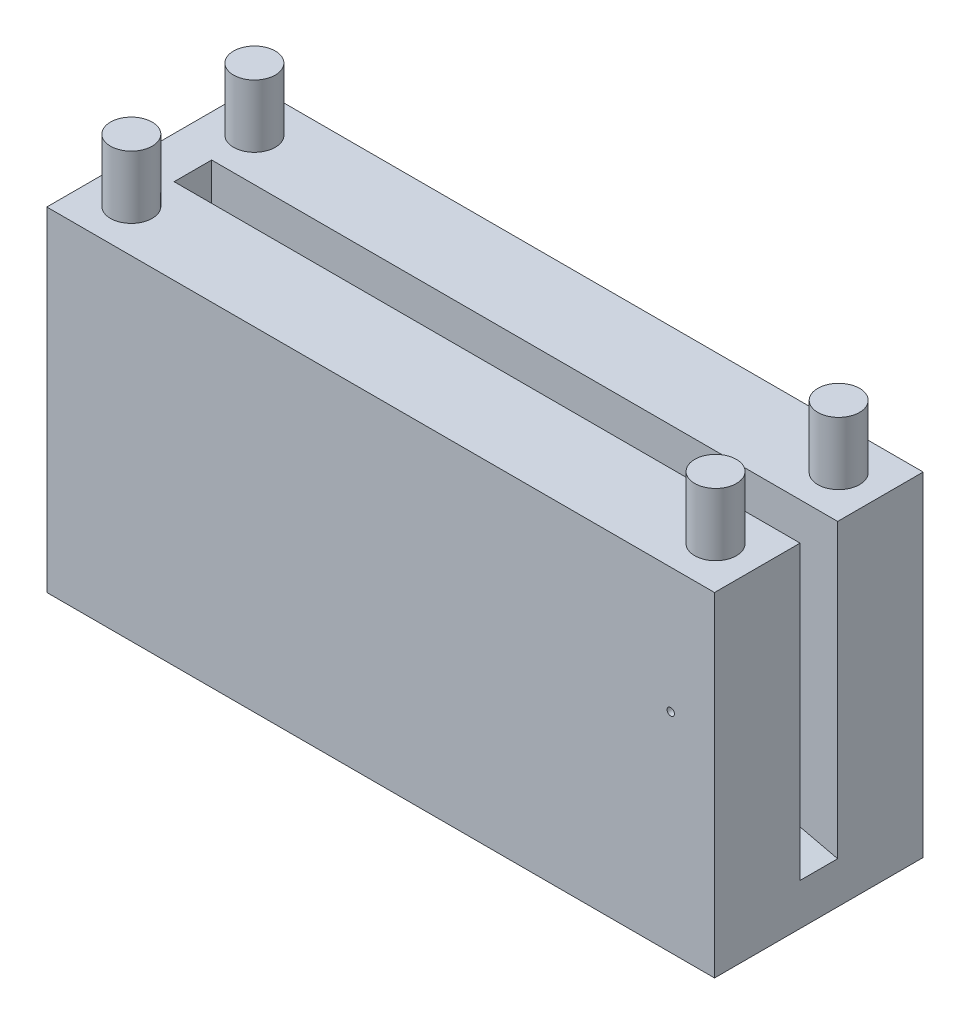
ISO-10303-21;
HEADER;
FILE_DESCRIPTION(('STEP AP214'),'2;1');
FILE_NAME('part.step','',(''),(''),'','','');
FILE_SCHEMA(('AUTOMOTIVE_DESIGN { 1 0 10303 214 1 1 1 1 }'));
ENDSEC;
DATA;
#1=APPLICATION_CONTEXT('core data for automotive mechanical design processes');
#2=APPLICATION_PROTOCOL_DEFINITION('international standard','automotive_design',2000,#1);
#3=PRODUCT_CONTEXT('',#1,'mechanical');
#4=PRODUCT('Part','Part','',(#3));
#5=PRODUCT_RELATED_PRODUCT_CATEGORY('part','',(#4));
#6=PRODUCT_DEFINITION_FORMATION('','',#4);
#7=PRODUCT_DEFINITION_CONTEXT('part definition',#1,'design');
#8=PRODUCT_DEFINITION('design','',#6,#7);
#9=PRODUCT_DEFINITION_SHAPE('','',#8);
#10=(LENGTH_UNIT() NAMED_UNIT(*) SI_UNIT(.MILLI.,.METRE.));
#11=(NAMED_UNIT(*) PLANE_ANGLE_UNIT() SI_UNIT($,.RADIAN.));
#12=(NAMED_UNIT(*) SI_UNIT($,.STERADIAN.) SOLID_ANGLE_UNIT());
#13=UNCERTAINTY_MEASURE_WITH_UNIT(LENGTH_MEASURE(1.E-05),#10,'distance_accuracy_value','');
#14=(GEOMETRIC_REPRESENTATION_CONTEXT(3) GLOBAL_UNCERTAINTY_ASSIGNED_CONTEXT((#13)) GLOBAL_UNIT_ASSIGNED_CONTEXT((#10,
#11,#12)) REPRESENTATION_CONTEXT('',''));
#15=CARTESIAN_POINT('',(0.,0.,0.));
#16=DIRECTION('',(0.,0.,1.));
#17=DIRECTION('',(1.,0.,0.));
#18=AXIS2_PLACEMENT_3D('',#15,#16,#17);
#19=CARTESIAN_POINT('',(101.6,101.6,-31.75));
#20=DIRECTION('',(-1.,0.,0.));
#21=DIRECTION('',(0.,0.,1.));
#22=AXIS2_PLACEMENT_3D('',#19,#20,#21);
#23=PLANE('',#22);
#24=DIRECTION('',(0.,1.,0.));
#25=VECTOR('',#24,1.);
#26=CARTESIAN_POINT('',(101.6,95.25,-5.71500000000001));
#27=LINE('',#26,#25);
#28=CARTESIAN_POINT('',(101.6,12.7,-5.71500000000001));
#29=VERTEX_POINT('',#28);
#30=CARTESIAN_POINT('',(101.6,101.6,-5.71500000000001));
#31=VERTEX_POINT('',#30);
#32=EDGE_CURVE('E117',#29,#31,#27,.T.);
#33=ORIENTED_EDGE('',*,*,#32,.F.);
#34=DIRECTION('',(0.,0.,-1.));
#35=VECTOR('',#34,1.);
#36=CARTESIAN_POINT('',(101.6,12.7,215.937406037035));
#37=LINE('',#36,#35);
#38=CARTESIAN_POINT('',(101.6,12.7,5.715));
#39=VERTEX_POINT('',#38);
#40=EDGE_CURVE('E124',#39,#29,#37,.T.);
#41=ORIENTED_EDGE('',*,*,#40,.F.);
#42=DIRECTION('',(0.,1.,0.));
#43=VECTOR('',#42,1.);
#44=CARTESIAN_POINT('',(101.6,95.25,5.71499999999999));
#45=LINE('',#44,#43);
#46=CARTESIAN_POINT('',(101.6,101.6,5.71499999999999));
#47=VERTEX_POINT('',#46);
#48=EDGE_CURVE('E107',#39,#47,#45,.T.);
#49=ORIENTED_EDGE('',*,*,#48,.T.);
#50=DIRECTION('',(0.,0.,-1.));
#51=VECTOR('',#50,1.);
#52=CARTESIAN_POINT('',(101.6,101.6,-31.75));
#53=LINE('',#52,#51);
#54=CARTESIAN_POINT('',(101.6,101.6,31.75));
#55=VERTEX_POINT('',#54);
#56=EDGE_CURVE('E144',#55,#47,#53,.T.);
#57=ORIENTED_EDGE('',*,*,#56,.F.);
#58=DIRECTION('',(0.,-1.,0.));
#59=VECTOR('',#58,1.);
#60=CARTESIAN_POINT('',(101.6,101.6,31.75));
#61=LINE('',#60,#59);
#62=CARTESIAN_POINT('',(101.6,0.,31.75));
#63=VERTEX_POINT('',#62);
#64=EDGE_CURVE('E151',#55,#63,#61,.T.);
#65=ORIENTED_EDGE('',*,*,#64,.T.);
#66=DIRECTION('',(0.,0.,-1.));
#67=VECTOR('',#66,1.);
#68=CARTESIAN_POINT('',(101.6,0.,-31.75));
#69=LINE('',#68,#67);
#70=CARTESIAN_POINT('',(101.6,0.,-31.75));
#71=VERTEX_POINT('',#70);
#72=EDGE_CURVE('E140',#63,#71,#69,.T.);
#73=ORIENTED_EDGE('',*,*,#72,.T.);
#74=DIRECTION('',(0.,-1.,0.));
#75=VECTOR('',#74,1.);
#76=CARTESIAN_POINT('',(101.6,101.6,-31.75));
#77=LINE('',#76,#75);
#78=CARTESIAN_POINT('',(101.6,101.6,-31.75));
#79=VERTEX_POINT('',#78);
#80=EDGE_CURVE('E11',#79,#71,#77,.T.);
#81=ORIENTED_EDGE('',*,*,#80,.F.);
#82=EDGE_CURVE('E84',#31,#79,#53,.T.);
#83=ORIENTED_EDGE('',*,*,#82,.F.);
#84=EDGE_LOOP('',(#33,#41,#49,#57,#65,#73,#81,#83));
#85=FACE_BOUND('',#84,.T.);
#86=ADVANCED_FACE('F33',(#85),#23,.F.);
#87=CARTESIAN_POINT('',(-101.6,101.6,-31.75));
#88=DIRECTION('',(0.,0.,1.));
#89=DIRECTION('',(1.,0.,0.));
#90=AXIS2_PLACEMENT_3D('',#87,#88,#89);
#91=PLANE('',#90);
#92=CARTESIAN_POINT('',(88.265,63.5,-31.75));
#93=DIRECTION('',(0.,0.,1.));
#94=DIRECTION('',(1.,0.,0.));
#95=AXIS2_PLACEMENT_3D('',#92,#93,#94);
#96=CIRCLE('',#95,1.125000036);
#97=CARTESIAN_POINT('',(89.3900000359999,63.5,-31.75));
#98=VERTEX_POINT('',#97);
#99=EDGE_CURVE('E198',#98,#98,#96,.T.);
#100=ORIENTED_EDGE('',*,*,#99,.T.);
#101=EDGE_LOOP('',(#100));
#102=FACE_BOUND('',#101,.T.);
#103=DIRECTION('',(-1.,0.,0.));
#104=VECTOR('',#103,1.);
#105=CARTESIAN_POINT('',(-101.6,0.,-31.75));
#106=LINE('',#105,#104);
#107=CARTESIAN_POINT('',(-101.6,0.,-31.75));
#108=VERTEX_POINT('',#107);
#109=EDGE_CURVE('E154',#71,#108,#106,.T.);
#110=ORIENTED_EDGE('',*,*,#109,.T.);
#111=DIRECTION('',(0.,-1.,0.));
#112=VECTOR('',#111,1.);
#113=CARTESIAN_POINT('',(-101.6,101.6,-31.75));
#114=LINE('',#113,#112);
#115=CARTESIAN_POINT('',(-101.6,101.6,-31.75));
#116=VERTEX_POINT('',#115);
#117=EDGE_CURVE('E41',#116,#108,#114,.T.);
#118=ORIENTED_EDGE('',*,*,#117,.F.);
#119=DIRECTION('',(-1.,0.,0.));
#120=VECTOR('',#119,1.);
#121=CARTESIAN_POINT('',(-101.6,101.6,-31.75));
#122=LINE('',#121,#120);
#123=EDGE_CURVE('E146',#79,#116,#122,.T.);
#124=ORIENTED_EDGE('',*,*,#123,.F.);
#125=ORIENTED_EDGE('',*,*,#80,.T.);
#126=EDGE_LOOP('',(#110,#118,#124,#125));
#127=FACE_BOUND('',#126,.T.);
#128=ADVANCED_FACE('F185',(#102,#127),#91,.F.);
#129=CARTESIAN_POINT('',(-101.6,101.6,-31.75));
#130=DIRECTION('',(1.,0.,0.));
#131=DIRECTION('',(0.,0.,-1.));
#132=AXIS2_PLACEMENT_3D('',#129,#130,#131);
#133=PLANE('',#132);
#134=DIRECTION('',(0.,0.,1.));
#135=VECTOR('',#134,1.);
#136=CARTESIAN_POINT('',(-101.6,0.,-31.75));
#137=LINE('',#136,#135);
#138=CARTESIAN_POINT('',(-101.6,0.,31.75));
#139=VERTEX_POINT('',#138);
#140=EDGE_CURVE('E156',#108,#139,#137,.T.);
#141=ORIENTED_EDGE('',*,*,#140,.T.);
#142=DIRECTION('',(0.,-1.,0.));
#143=VECTOR('',#142,1.);
#144=CARTESIAN_POINT('',(-101.6,101.6,31.75));
#145=LINE('',#144,#143);
#146=CARTESIAN_POINT('',(-101.6,101.6,31.75));
#147=VERTEX_POINT('',#146);
#148=EDGE_CURVE('E160',#147,#139,#145,.T.);
#149=ORIENTED_EDGE('',*,*,#148,.F.);
#150=DIRECTION('',(0.,0.,1.));
#151=VECTOR('',#150,1.);
#152=CARTESIAN_POINT('',(-101.6,101.6,-31.75));
#153=LINE('',#152,#151);
#154=EDGE_CURVE('E148',#116,#147,#153,.T.);
#155=ORIENTED_EDGE('',*,*,#154,.F.);
#156=ORIENTED_EDGE('',*,*,#117,.T.);
#157=EDGE_LOOP('',(#141,#149,#155,#156));
#158=FACE_BOUND('',#157,.T.);
#159=ADVANCED_FACE('F167',(#158),#133,.F.);
#160=CARTESIAN_POINT('',(-101.6,101.6,31.75));
#161=DIRECTION('',(0.,0.,-1.));
#162=DIRECTION('',(-1.,0.,0.));
#163=AXIS2_PLACEMENT_3D('',#160,#161,#162);
#164=PLANE('',#163);
#165=CARTESIAN_POINT('',(88.265,63.5,31.75));
#166=DIRECTION('',(0.,0.,1.));
#167=DIRECTION('',(1.,0.,0.));
#168=AXIS2_PLACEMENT_3D('',#165,#166,#167);
#169=CIRCLE('',#168,1.125000036);
#170=CARTESIAN_POINT('',(89.3900000359999,63.5,31.75));
#171=VERTEX_POINT('',#170);
#172=EDGE_CURVE('E304',#171,#171,#169,.T.);
#173=ORIENTED_EDGE('',*,*,#172,.F.);
#174=EDGE_LOOP('',(#173));
#175=FACE_BOUND('',#174,.T.);
#176=DIRECTION('',(1.,0.,0.));
#177=VECTOR('',#176,1.);
#178=CARTESIAN_POINT('',(-101.6,0.,31.75));
#179=LINE('',#178,#177);
#180=EDGE_CURVE('E78',#139,#63,#179,.T.);
#181=ORIENTED_EDGE('',*,*,#180,.T.);
#182=ORIENTED_EDGE('',*,*,#64,.F.);
#183=DIRECTION('',(1.,0.,0.));
#184=VECTOR('',#183,1.);
#185=CARTESIAN_POINT('',(-101.6,101.6,31.75));
#186=LINE('',#185,#184);
#187=EDGE_CURVE('E57',#147,#55,#186,.T.);
#188=ORIENTED_EDGE('',*,*,#187,.F.);
#189=ORIENTED_EDGE('',*,*,#148,.T.);
#190=EDGE_LOOP('',(#181,#182,#188,#189));
#191=FACE_BOUND('',#190,.T.);
#192=ADVANCED_FACE('F174',(#175,#191),#164,.F.);
#193=CARTESIAN_POINT('',(0.,101.6,0.));
#194=DIRECTION('',(0.,1.,0.));
#195=DIRECTION('',(0.,0.,1.));
#196=AXIS2_PLACEMENT_3D('',#193,#194,#195);
#197=PLANE('',#196);
#198=CARTESIAN_POINT('',(88.9,101.6,-18.7325));
#199=DIRECTION('',(0.,1.,0.));
#200=DIRECTION('',(0.,0.,1.));
#201=AXIS2_PLACEMENT_3D('',#198,#199,#200);
#202=CIRCLE('',#201,6.35);
#203=CARTESIAN_POINT('',(88.9,101.6,-25.0825));
#204=VERTEX_POINT('',#203);
#205=EDGE_CURVE('E261',#204,#204,#202,.T.);
#206=ORIENTED_EDGE('',*,*,#205,.F.);
#207=EDGE_LOOP('',(#206));
#208=FACE_BOUND('',#207,.T.);
#209=CARTESIAN_POINT('',(-88.9,101.6,-18.7325));
#210=DIRECTION('',(0.,1.,0.));
#211=DIRECTION('',(0.,0.,1.));
#212=AXIS2_PLACEMENT_3D('',#209,#210,#211);
#213=CIRCLE('',#212,6.35);
#214=CARTESIAN_POINT('',(-88.9,101.6,-25.0825));
#215=VERTEX_POINT('',#214);
#216=EDGE_CURVE('E271',#215,#215,#213,.T.);
#217=ORIENTED_EDGE('',*,*,#216,.F.);
#218=EDGE_LOOP('',(#217));
#219=FACE_BOUND('',#218,.T.);
#220=CARTESIAN_POINT('',(-88.9,101.6,18.7325));
#221=DIRECTION('',(0.,1.,0.));
#222=DIRECTION('',(0.,0.,1.));
#223=AXIS2_PLACEMENT_3D('',#220,#221,#222);
#224=CIRCLE('',#223,6.35);
#225=CARTESIAN_POINT('',(-88.9,101.6,12.3825));
#226=VERTEX_POINT('',#225);
#227=EDGE_CURVE('E276',#226,#226,#224,.T.);
#228=ORIENTED_EDGE('',*,*,#227,.F.);
#229=EDGE_LOOP('',(#228));
#230=FACE_BOUND('',#229,.T.);
#231=CARTESIAN_POINT('',(88.9,101.6,18.7325));
#232=DIRECTION('',(0.,1.,0.));
#233=DIRECTION('',(0.,0.,1.));
#234=AXIS2_PLACEMENT_3D('',#231,#232,#233);
#235=CIRCLE('',#234,6.35);
#236=CARTESIAN_POINT('',(88.9,101.6,12.3825));
#237=VERTEX_POINT('',#236);
#238=EDGE_CURVE('E282',#237,#237,#235,.T.);
#239=ORIENTED_EDGE('',*,*,#238,.F.);
#240=EDGE_LOOP('',(#239));
#241=FACE_BOUND('',#240,.T.);
#242=DIRECTION('',(-1.,0.,0.));
#243=VECTOR('',#242,1.);
#244=CARTESIAN_POINT('',(101.6,101.6,-5.71500000000001));
#245=LINE('',#244,#243);
#246=CARTESIAN_POINT('',(-88.9,101.6,-5.71500000000001));
#247=VERTEX_POINT('',#246);
#248=EDGE_CURVE('E48',#31,#247,#245,.T.);
#249=ORIENTED_EDGE('',*,*,#248,.F.);
#250=ORIENTED_EDGE('',*,*,#82,.T.);
#251=ORIENTED_EDGE('',*,*,#123,.T.);
#252=ORIENTED_EDGE('',*,*,#154,.T.);
#253=ORIENTED_EDGE('',*,*,#187,.T.);
#254=ORIENTED_EDGE('',*,*,#56,.T.);
#255=DIRECTION('',(1.,0.,0.));
#256=VECTOR('',#255,1.);
#257=CARTESIAN_POINT('',(101.6,101.6,5.71499999999999));
#258=LINE('',#257,#256);
#259=CARTESIAN_POINT('',(-88.9,101.6,5.71499999999999));
#260=VERTEX_POINT('',#259);
#261=EDGE_CURVE('E113',#260,#47,#258,.T.);
#262=ORIENTED_EDGE('',*,*,#261,.F.);
#263=DIRECTION('',(0.,0.,1.));
#264=VECTOR('',#263,1.);
#265=CARTESIAN_POINT('',(-88.9,101.6,-5.71500000000001));
#266=LINE('',#265,#264);
#267=EDGE_CURVE('E135',#247,#260,#266,.T.);
#268=ORIENTED_EDGE('',*,*,#267,.F.);
#269=EDGE_LOOP('',(#249,#250,#251,#252,#253,#254,#262,#268));
#270=FACE_BOUND('',#269,.T.);
#271=ADVANCED_FACE('F176',(#208,#219,#230,#241,#270),#197,.T.);
#272=CARTESIAN_POINT('',(0.,0.,0.));
#273=DIRECTION('',(0.,1.,0.));
#274=DIRECTION('',(0.,0.,1.));
#275=AXIS2_PLACEMENT_3D('',#272,#273,#274);
#276=PLANE('',#275);
#277=ORIENTED_EDGE('',*,*,#72,.F.);
#278=ORIENTED_EDGE('',*,*,#180,.F.);
#279=ORIENTED_EDGE('',*,*,#140,.F.);
#280=ORIENTED_EDGE('',*,*,#109,.F.);
#281=EDGE_LOOP('',(#277,#278,#279,#280));
#282=FACE_BOUND('',#281,.T.);
#283=ADVANCED_FACE('F172',(#282),#276,.F.);
#284=CARTESIAN_POINT('',(101.6,95.25,-5.71500000000001));
#285=DIRECTION('',(0.,0.,-1.));
#286=DIRECTION('',(-1.,0.,0.));
#287=AXIS2_PLACEMENT_3D('',#284,#285,#286);
#288=PLANE('',#287);
#289=CARTESIAN_POINT('',(88.265,63.5,-5.71500000000001));
#290=DIRECTION('',(0.,0.,-1.));
#291=DIRECTION('',(-1.,0.,0.));
#292=AXIS2_PLACEMENT_3D('',#289,#290,#291);
#293=CIRCLE('',#292,1.125000036);
#294=CARTESIAN_POINT('',(87.139999964,63.5,-5.71500000000001));
#295=VERTEX_POINT('',#294);
#296=EDGE_CURVE('E260',#295,#295,#293,.T.);
#297=ORIENTED_EDGE('',*,*,#296,.T.);
#298=EDGE_LOOP('',(#297));
#299=FACE_BOUND('',#298,.T.);
#300=ORIENTED_EDGE('',*,*,#248,.T.);
#301=DIRECTION('',(0.,1.,0.));
#302=VECTOR('',#301,1.);
#303=CARTESIAN_POINT('',(-88.9,95.25,-5.71500000000001));
#304=LINE('',#303,#302);
#305=CARTESIAN_POINT('',(-88.9,57.15,-5.71500000000001));
#306=VERTEX_POINT('',#305);
#307=EDGE_CURVE('E139',#306,#247,#304,.T.);
#308=ORIENTED_EDGE('',*,*,#307,.F.);
#309=DIRECTION('',(0.973841209741793,-0.227229615606418,0.));
#310=VECTOR('',#309,1.);
#311=CARTESIAN_POINT('',(-88.9,57.15,-5.71500000000001));
#312=LINE('',#311,#310);
#313=EDGE_CURVE('E129',#306,#29,#312,.T.);
#314=ORIENTED_EDGE('',*,*,#313,.T.);
#315=ORIENTED_EDGE('',*,*,#32,.T.);
#316=EDGE_LOOP('',(#300,#308,#314,#315));
#317=FACE_BOUND('',#316,.T.);
#318=ADVANCED_FACE('F202',(#299,#317),#288,.F.);
#319=CARTESIAN_POINT('',(101.6,95.25,5.71499999999999));
#320=DIRECTION('',(0.,0.,1.));
#321=DIRECTION('',(1.,0.,0.));
#322=AXIS2_PLACEMENT_3D('',#319,#320,#321);
#323=PLANE('',#322);
#324=CARTESIAN_POINT('',(88.265,63.5,5.71499999999999));
#325=DIRECTION('',(0.,0.,1.));
#326=DIRECTION('',(1.,0.,0.));
#327=AXIS2_PLACEMENT_3D('',#324,#325,#326);
#328=CIRCLE('',#327,1.125000036);
#329=CARTESIAN_POINT('',(89.3900000359999,63.5,5.71499999999999));
#330=VERTEX_POINT('',#329);
#331=EDGE_CURVE('E36',#330,#330,#328,.T.);
#332=ORIENTED_EDGE('',*,*,#331,.T.);
#333=EDGE_LOOP('',(#332));
#334=FACE_BOUND('',#333,.T.);
#335=ORIENTED_EDGE('',*,*,#261,.T.);
#336=ORIENTED_EDGE('',*,*,#48,.F.);
#337=DIRECTION('',(0.973841209741793,-0.227229615606418,0.));
#338=VECTOR('',#337,1.);
#339=CARTESIAN_POINT('',(-88.9,57.15,5.715));
#340=LINE('',#339,#338);
#341=CARTESIAN_POINT('',(-88.9,57.15,5.715));
#342=VERTEX_POINT('',#341);
#343=EDGE_CURVE('E110',#342,#39,#340,.T.);
#344=ORIENTED_EDGE('',*,*,#343,.F.);
#345=DIRECTION('',(0.,1.,0.));
#346=VECTOR('',#345,1.);
#347=CARTESIAN_POINT('',(-88.9,95.25,5.71499999999999));
#348=LINE('',#347,#346);
#349=EDGE_CURVE('E118',#342,#260,#348,.T.);
#350=ORIENTED_EDGE('',*,*,#349,.T.);
#351=EDGE_LOOP('',(#335,#336,#344,#350));
#352=FACE_BOUND('',#351,.T.);
#353=ADVANCED_FACE('F109',(#334,#352),#323,.F.);
#354=CARTESIAN_POINT('',(-88.9,95.25,-5.71500000000001));
#355=DIRECTION('',(-1.,0.,0.));
#356=DIRECTION('',(0.,0.,1.));
#357=AXIS2_PLACEMENT_3D('',#354,#355,#356);
#358=PLANE('',#357);
#359=ORIENTED_EDGE('',*,*,#267,.T.);
#360=ORIENTED_EDGE('',*,*,#349,.F.);
#361=DIRECTION('',(0.,0.,-1.));
#362=VECTOR('',#361,1.);
#363=CARTESIAN_POINT('',(-88.9,57.15,215.937406037035));
#364=LINE('',#363,#362);
#365=EDGE_CURVE('E127',#342,#306,#364,.T.);
#366=ORIENTED_EDGE('',*,*,#365,.T.);
#367=ORIENTED_EDGE('',*,*,#307,.T.);
#368=EDGE_LOOP('',(#359,#360,#366,#367));
#369=FACE_BOUND('',#368,.T.);
#370=ADVANCED_FACE('F201',(#369),#358,.F.);
#371=CARTESIAN_POINT('',(-88.9,57.15,215.937406037035));
#372=DIRECTION('',(0.227229615606418,0.973841209741793,0.));
#373=DIRECTION('',(-0.973841209741793,0.227229615606418,0.));
#374=AXIS2_PLACEMENT_3D('',#371,#372,#373);
#375=PLANE('',#374);
#376=ORIENTED_EDGE('',*,*,#343,.T.);
#377=ORIENTED_EDGE('',*,*,#40,.T.);
#378=ORIENTED_EDGE('',*,*,#313,.F.);
#379=ORIENTED_EDGE('',*,*,#365,.F.);
#380=EDGE_LOOP('',(#376,#377,#378,#379));
#381=FACE_BOUND('',#380,.T.);
#382=ADVANCED_FACE('F122',(#381),#375,.T.);
#383=CARTESIAN_POINT('',(88.9,120.65,18.7325));
#384=DIRECTION('',(0.,-1.,0.));
#385=DIRECTION('',(0.,0.,-1.));
#386=AXIS2_PLACEMENT_3D('',#383,#384,#385);
#387=CYLINDRICAL_SURFACE('',#386,6.35);
#388=CARTESIAN_POINT('',(88.9,120.65,18.7325));
#389=DIRECTION('',(0.,1.,0.));
#390=DIRECTION('',(0.,0.,1.));
#391=AXIS2_PLACEMENT_3D('',#388,#389,#390);
#392=CIRCLE('',#391,6.35);
#393=CARTESIAN_POINT('',(88.9,120.65,12.3825));
#394=VERTEX_POINT('',#393);
#395=EDGE_CURVE('E285',#394,#394,#392,.T.);
#396=CARTESIAN_POINT('',(88.9,120.65,12.3825));
#397=CARTESIAN_POINT('',(88.9,120.4515625,12.3825));
#398=CARTESIAN_POINT('',(88.9,120.253125,12.3825));
#399=CARTESIAN_POINT('',(88.9,119.85625,12.3825));
#400=CARTESIAN_POINT('',(88.9,119.6578125,12.3825));
#401=CARTESIAN_POINT('',(88.9,119.2609375,12.3825));
#402=CARTESIAN_POINT('',(88.9,119.0625,12.3825));
#403=CARTESIAN_POINT('',(88.9,118.665625,12.3825));
#404=CARTESIAN_POINT('',(88.9,118.4671875,12.3825));
#405=CARTESIAN_POINT('',(88.9,118.0703125,12.3825));
#406=CARTESIAN_POINT('',(88.9,117.871875,12.3825));
#407=CARTESIAN_POINT('',(88.9,117.475,12.3825));
#408=CARTESIAN_POINT('',(88.9,117.2765625,12.3825));
#409=CARTESIAN_POINT('',(88.9,116.8796875,12.3825));
#410=CARTESIAN_POINT('',(88.9,116.68125,12.3825));
#411=CARTESIAN_POINT('',(88.9,116.284375,12.3825));
#412=CARTESIAN_POINT('',(88.9,116.0859375,12.3825));
#413=CARTESIAN_POINT('',(88.9,115.6890625,12.3825));
#414=CARTESIAN_POINT('',(88.9,115.490625,12.3825));
#415=CARTESIAN_POINT('',(88.9,115.09375,12.3825));
#416=CARTESIAN_POINT('',(88.9,114.8953125,12.3825));
#417=CARTESIAN_POINT('',(88.9,114.4984375,12.3825));
#418=CARTESIAN_POINT('',(88.9,114.3,12.3825));
#419=CARTESIAN_POINT('',(88.9,113.903125,12.3825));
#420=CARTESIAN_POINT('',(88.9,113.7046875,12.3825));
#421=CARTESIAN_POINT('',(88.9,113.3078125,12.3825));
#422=CARTESIAN_POINT('',(88.9,113.109375,12.3825));
#423=CARTESIAN_POINT('',(88.9,112.7125,12.3825));
#424=CARTESIAN_POINT('',(88.9,112.5140625,12.3825));
#425=CARTESIAN_POINT('',(88.9,112.1171875,12.3825));
#426=CARTESIAN_POINT('',(88.9,111.91875,12.3825));
#427=CARTESIAN_POINT('',(88.9,111.521875,12.3825));
#428=CARTESIAN_POINT('',(88.9,111.3234375,12.3825));
#429=CARTESIAN_POINT('',(88.9,110.9265625,12.3825));
#430=CARTESIAN_POINT('',(88.9,110.728125,12.3825));
#431=CARTESIAN_POINT('',(88.9,110.33125,12.3825));
#432=CARTESIAN_POINT('',(88.9,110.1328125,12.3825));
#433=CARTESIAN_POINT('',(88.9,109.7359375,12.3825));
#434=CARTESIAN_POINT('',(88.9,109.5375,12.3825));
#435=CARTESIAN_POINT('',(88.9,109.140625,12.3825));
#436=CARTESIAN_POINT('',(88.9,108.9421875,12.3825));
#437=CARTESIAN_POINT('',(88.9,108.5453125,12.3825));
#438=CARTESIAN_POINT('',(88.9,108.346875,12.3825));
#439=CARTESIAN_POINT('',(88.9,107.95,12.3825));
#440=CARTESIAN_POINT('',(88.9,107.7515625,12.3825));
#441=CARTESIAN_POINT('',(88.9,107.3546875,12.3825));
#442=CARTESIAN_POINT('',(88.9,107.15625,12.3825));
#443=CARTESIAN_POINT('',(88.9,106.759375,12.3825));
#444=CARTESIAN_POINT('',(88.9,106.5609375,12.3825));
#445=CARTESIAN_POINT('',(88.9,106.1640625,12.3825));
#446=CARTESIAN_POINT('',(88.9,105.965625,12.3825));
#447=CARTESIAN_POINT('',(88.9,105.56875,12.3825));
#448=CARTESIAN_POINT('',(88.9,105.3703125,12.3825));
#449=CARTESIAN_POINT('',(88.9,104.9734375,12.3825));
#450=CARTESIAN_POINT('',(88.9,104.775,12.3825));
#451=CARTESIAN_POINT('',(88.9,104.378125,12.3825));
#452=CARTESIAN_POINT('',(88.9,104.1796875,12.3825));
#453=CARTESIAN_POINT('',(88.9,103.7828125,12.3825));
#454=CARTESIAN_POINT('',(88.9,103.584375,12.3825));
#455=CARTESIAN_POINT('',(88.9,103.1875,12.3825));
#456=CARTESIAN_POINT('',(88.9,102.9890625,12.3825));
#457=CARTESIAN_POINT('',(88.9,102.5921875,12.3825));
#458=CARTESIAN_POINT('',(88.9,102.39375,12.3825));
#459=CARTESIAN_POINT('',(88.9,101.996875,12.3825));
#460=CARTESIAN_POINT('',(88.9,101.7984375,12.3825));
#461=CARTESIAN_POINT('',(88.9,101.6,12.3825));
#462=B_SPLINE_CURVE_WITH_KNOTS('',3,(#396,#397,#398,#399,#400,#401,#402,#403,#404,#405,#406,
#407,#408,#409,#410,#411,#412,#413,#414,#415,#416,#417,#418,#419,#420,#421,#422,#423,#424,#425,
#426,#427,#428,#429,#430,#431,#432,#433,#434,#435,#436,#437,#438,#439,#440,#441,#442,#443,#444,
#445,#446,#447,#448,#449,#450,#451,#452,#453,#454,#455,#456,#457,#458,#459,#460,#461),
.UNSPECIFIED.,.F.,.F.,(4,2,2,2,2,2,2,2,2,2,2,2,2,2,2,2,2,2,2,2,2,2,2,2,2,2,2,2,2,2,2,2,4),(0.,
0.595312499999986,1.19062499999999,1.78593749999999,2.38124999999999,2.97656249999999,
3.57187499999999,4.16718749999999,4.76249999999999,5.35781249999999,5.95312499999999,
6.54843749999999,7.14374999999999,7.73906249999999,8.33437499999999,8.92968749999999,
9.52499999999999,10.1203125,10.715625,11.3109375,11.90625,12.5015625,13.096875,13.6921875,
14.2875,14.8828125,15.478125,16.0734375,16.66875,17.2640625,17.859375,18.4546875,19.05),.UNSPECIFIED.);
#463=EDGE_CURVE('BSEAM218',#394,#237,#462,.T.);
#464=ORIENTED_EDGE('',*,*,#395,.F.);
#465=ORIENTED_EDGE('',*,*,#238,.T.);
#466=ORIENTED_EDGE('',*,*,#463,.T.);
#467=ORIENTED_EDGE('',*,*,#463,.F.);
#468=EDGE_LOOP('',(#464,#466,#465,#467));
#469=FACE_BOUND('',#468,.T.);
#470=ADVANCED_FACE('F218',(#469),#387,.T.);
#471=CARTESIAN_POINT('',(88.9,120.65,18.7325));
#472=DIRECTION('',(0.,1.,0.));
#473=DIRECTION('',(0.,0.,1.));
#474=AXIS2_PLACEMENT_3D('',#471,#472,#473);
#475=PLANE('',#474);
#476=ORIENTED_EDGE('',*,*,#395,.T.);
#477=EDGE_LOOP('',(#476));
#478=FACE_BOUND('',#477,.T.);
#479=ADVANCED_FACE('F221',(#478),#475,.T.);
#480=CARTESIAN_POINT('',(-88.9,120.65,18.7325));
#481=DIRECTION('',(0.,-1.,0.));
#482=DIRECTION('',(0.,0.,-1.));
#483=AXIS2_PLACEMENT_3D('',#480,#481,#482);
#484=CYLINDRICAL_SURFACE('',#483,6.35);
#485=CARTESIAN_POINT('',(-88.9,120.65,18.7325));
#486=DIRECTION('',(0.,1.,0.));
#487=DIRECTION('',(0.,0.,1.));
#488=AXIS2_PLACEMENT_3D('',#485,#486,#487);
#489=CIRCLE('',#488,6.35);
#490=CARTESIAN_POINT('',(-88.9,120.65,12.3825));
#491=VERTEX_POINT('',#490);
#492=EDGE_CURVE('E279',#491,#491,#489,.T.);
#493=CARTESIAN_POINT('',(-88.9,120.65,12.3825));
#494=CARTESIAN_POINT('',(-88.9,120.4515625,12.3825));
#495=CARTESIAN_POINT('',(-88.9,120.253125,12.3825));
#496=CARTESIAN_POINT('',(-88.9,119.85625,12.3825));
#497=CARTESIAN_POINT('',(-88.9,119.6578125,12.3825));
#498=CARTESIAN_POINT('',(-88.9,119.2609375,12.3825));
#499=CARTESIAN_POINT('',(-88.9,119.0625,12.3825));
#500=CARTESIAN_POINT('',(-88.9,118.665625,12.3825));
#501=CARTESIAN_POINT('',(-88.9,118.4671875,12.3825));
#502=CARTESIAN_POINT('',(-88.9,118.0703125,12.3825));
#503=CARTESIAN_POINT('',(-88.9,117.871875,12.3825));
#504=CARTESIAN_POINT('',(-88.9,117.475,12.3825));
#505=CARTESIAN_POINT('',(-88.9,117.2765625,12.3825));
#506=CARTESIAN_POINT('',(-88.9,116.8796875,12.3825));
#507=CARTESIAN_POINT('',(-88.9,116.68125,12.3825));
#508=CARTESIAN_POINT('',(-88.9,116.284375,12.3825));
#509=CARTESIAN_POINT('',(-88.9,116.0859375,12.3825));
#510=CARTESIAN_POINT('',(-88.9,115.6890625,12.3825));
#511=CARTESIAN_POINT('',(-88.9,115.490625,12.3825));
#512=CARTESIAN_POINT('',(-88.9,115.09375,12.3825));
#513=CARTESIAN_POINT('',(-88.9,114.8953125,12.3825));
#514=CARTESIAN_POINT('',(-88.9,114.4984375,12.3825));
#515=CARTESIAN_POINT('',(-88.9,114.3,12.3825));
#516=CARTESIAN_POINT('',(-88.9,113.903125,12.3825));
#517=CARTESIAN_POINT('',(-88.9,113.7046875,12.3825));
#518=CARTESIAN_POINT('',(-88.9,113.3078125,12.3825));
#519=CARTESIAN_POINT('',(-88.9,113.109375,12.3825));
#520=CARTESIAN_POINT('',(-88.9,112.7125,12.3825));
#521=CARTESIAN_POINT('',(-88.9,112.5140625,12.3825));
#522=CARTESIAN_POINT('',(-88.9,112.1171875,12.3825));
#523=CARTESIAN_POINT('',(-88.9,111.91875,12.3825));
#524=CARTESIAN_POINT('',(-88.9,111.521875,12.3825));
#525=CARTESIAN_POINT('',(-88.9,111.3234375,12.3825));
#526=CARTESIAN_POINT('',(-88.9,110.9265625,12.3825));
#527=CARTESIAN_POINT('',(-88.9,110.728125,12.3825));
#528=CARTESIAN_POINT('',(-88.9,110.33125,12.3825));
#529=CARTESIAN_POINT('',(-88.9,110.1328125,12.3825));
#530=CARTESIAN_POINT('',(-88.9,109.7359375,12.3825));
#531=CARTESIAN_POINT('',(-88.9,109.5375,12.3825));
#532=CARTESIAN_POINT('',(-88.9,109.140625,12.3825));
#533=CARTESIAN_POINT('',(-88.9,108.9421875,12.3825));
#534=CARTESIAN_POINT('',(-88.9,108.5453125,12.3825));
#535=CARTESIAN_POINT('',(-88.9,108.346875,12.3825));
#536=CARTESIAN_POINT('',(-88.9,107.95,12.3825));
#537=CARTESIAN_POINT('',(-88.9,107.7515625,12.3825));
#538=CARTESIAN_POINT('',(-88.9,107.3546875,12.3825));
#539=CARTESIAN_POINT('',(-88.9,107.15625,12.3825));
#540=CARTESIAN_POINT('',(-88.9,106.759375,12.3825));
#541=CARTESIAN_POINT('',(-88.9,106.5609375,12.3825));
#542=CARTESIAN_POINT('',(-88.9,106.1640625,12.3825));
#543=CARTESIAN_POINT('',(-88.9,105.965625,12.3825));
#544=CARTESIAN_POINT('',(-88.9,105.56875,12.3825));
#545=CARTESIAN_POINT('',(-88.9,105.3703125,12.3825));
#546=CARTESIAN_POINT('',(-88.9,104.9734375,12.3825));
#547=CARTESIAN_POINT('',(-88.9,104.775,12.3825));
#548=CARTESIAN_POINT('',(-88.9,104.378125,12.3825));
#549=CARTESIAN_POINT('',(-88.9,104.1796875,12.3825));
#550=CARTESIAN_POINT('',(-88.9,103.7828125,12.3825));
#551=CARTESIAN_POINT('',(-88.9,103.584375,12.3825));
#552=CARTESIAN_POINT('',(-88.9,103.1875,12.3825));
#553=CARTESIAN_POINT('',(-88.9,102.9890625,12.3825));
#554=CARTESIAN_POINT('',(-88.9,102.5921875,12.3825));
#555=CARTESIAN_POINT('',(-88.9,102.39375,12.3825));
#556=CARTESIAN_POINT('',(-88.9,101.996875,12.3825));
#557=CARTESIAN_POINT('',(-88.9,101.7984375,12.3825));
#558=CARTESIAN_POINT('',(-88.9,101.6,12.3825));
#559=B_SPLINE_CURVE_WITH_KNOTS('',3,(#493,#494,#495,#496,#497,#498,#499,#500,#501,#502,#503,
#504,#505,#506,#507,#508,#509,#510,#511,#512,#513,#514,#515,#516,#517,#518,#519,#520,#521,#522,
#523,#524,#525,#526,#527,#528,#529,#530,#531,#532,#533,#534,#535,#536,#537,#538,#539,#540,#541,
#542,#543,#544,#545,#546,#547,#548,#549,#550,#551,#552,#553,#554,#555,#556,#557,#558),
.UNSPECIFIED.,.F.,.F.,(4,2,2,2,2,2,2,2,2,2,2,2,2,2,2,2,2,2,2,2,2,2,2,2,2,2,2,2,2,2,2,2,4),(0.,
0.595312499999986,1.19062499999999,1.78593749999999,2.38124999999999,2.97656249999999,
3.57187499999999,4.16718749999999,4.76249999999999,5.35781249999999,5.95312499999999,
6.54843749999999,7.14374999999999,7.73906249999999,8.33437499999999,8.92968749999999,
9.52499999999999,10.1203125,10.715625,11.3109375,11.90625,12.5015625,13.096875,13.6921875,
14.2875,14.8828125,15.478125,16.0734375,16.66875,17.2640625,17.859375,18.4546875,19.05),.UNSPECIFIED.);
#560=EDGE_CURVE('BSEAM225',#491,#226,#559,.T.);
#561=ORIENTED_EDGE('',*,*,#492,.F.);
#562=ORIENTED_EDGE('',*,*,#227,.T.);
#563=ORIENTED_EDGE('',*,*,#560,.T.);
#564=ORIENTED_EDGE('',*,*,#560,.F.);
#565=EDGE_LOOP('',(#561,#563,#562,#564));
#566=FACE_BOUND('',#565,.T.);
#567=ADVANCED_FACE('F225',(#566),#484,.T.);
#568=CARTESIAN_POINT('',(-88.9,120.65,18.7325));
#569=DIRECTION('',(0.,1.,0.));
#570=DIRECTION('',(0.,0.,1.));
#571=AXIS2_PLACEMENT_3D('',#568,#569,#570);
#572=PLANE('',#571);
#573=ORIENTED_EDGE('',*,*,#492,.T.);
#574=EDGE_LOOP('',(#573));
#575=FACE_BOUND('',#574,.T.);
#576=ADVANCED_FACE('F229',(#575),#572,.T.);
#577=CARTESIAN_POINT('',(-88.9,120.65,-18.7325));
#578=DIRECTION('',(0.,-1.,0.));
#579=DIRECTION('',(0.,0.,-1.));
#580=AXIS2_PLACEMENT_3D('',#577,#578,#579);
#581=CYLINDRICAL_SURFACE('',#580,6.35);
#582=CARTESIAN_POINT('',(-88.9,120.65,-18.7325));
#583=DIRECTION('',(0.,1.,0.));
#584=DIRECTION('',(0.,0.,1.));
#585=AXIS2_PLACEMENT_3D('',#582,#583,#584);
#586=CIRCLE('',#585,6.35);
#587=CARTESIAN_POINT('',(-88.9,120.65,-25.0825));
#588=VERTEX_POINT('',#587);
#589=EDGE_CURVE('E273',#588,#588,#586,.T.);
#590=CARTESIAN_POINT('',(-88.9,120.65,-25.0825));
#591=CARTESIAN_POINT('',(-88.9,120.4515625,-25.0825));
#592=CARTESIAN_POINT('',(-88.9,120.253125,-25.0825));
#593=CARTESIAN_POINT('',(-88.9,119.85625,-25.0825));
#594=CARTESIAN_POINT('',(-88.9,119.6578125,-25.0825));
#595=CARTESIAN_POINT('',(-88.9,119.2609375,-25.0825));
#596=CARTESIAN_POINT('',(-88.9,119.0625,-25.0825));
#597=CARTESIAN_POINT('',(-88.9,118.665625,-25.0825));
#598=CARTESIAN_POINT('',(-88.9,118.4671875,-25.0825));
#599=CARTESIAN_POINT('',(-88.9,118.0703125,-25.0825));
#600=CARTESIAN_POINT('',(-88.9,117.871875,-25.0825));
#601=CARTESIAN_POINT('',(-88.9,117.475,-25.0825));
#602=CARTESIAN_POINT('',(-88.9,117.2765625,-25.0825));
#603=CARTESIAN_POINT('',(-88.9,116.8796875,-25.0825));
#604=CARTESIAN_POINT('',(-88.9,116.68125,-25.0825));
#605=CARTESIAN_POINT('',(-88.9,116.284375,-25.0825));
#606=CARTESIAN_POINT('',(-88.9,116.0859375,-25.0825));
#607=CARTESIAN_POINT('',(-88.9,115.6890625,-25.0825));
#608=CARTESIAN_POINT('',(-88.9,115.490625,-25.0825));
#609=CARTESIAN_POINT('',(-88.9,115.09375,-25.0825));
#610=CARTESIAN_POINT('',(-88.9,114.8953125,-25.0825));
#611=CARTESIAN_POINT('',(-88.9,114.4984375,-25.0825));
#612=CARTESIAN_POINT('',(-88.9,114.3,-25.0825));
#613=CARTESIAN_POINT('',(-88.9,113.903125,-25.0825));
#614=CARTESIAN_POINT('',(-88.9,113.7046875,-25.0825));
#615=CARTESIAN_POINT('',(-88.9,113.3078125,-25.0825));
#616=CARTESIAN_POINT('',(-88.9,113.109375,-25.0825));
#617=CARTESIAN_POINT('',(-88.9,112.7125,-25.0825));
#618=CARTESIAN_POINT('',(-88.9,112.5140625,-25.0825));
#619=CARTESIAN_POINT('',(-88.9,112.1171875,-25.0825));
#620=CARTESIAN_POINT('',(-88.9,111.91875,-25.0825));
#621=CARTESIAN_POINT('',(-88.9,111.521875,-25.0825));
#622=CARTESIAN_POINT('',(-88.9,111.3234375,-25.0825));
#623=CARTESIAN_POINT('',(-88.9,110.9265625,-25.0825));
#624=CARTESIAN_POINT('',(-88.9,110.728125,-25.0825));
#625=CARTESIAN_POINT('',(-88.9,110.33125,-25.0825));
#626=CARTESIAN_POINT('',(-88.9,110.1328125,-25.0825));
#627=CARTESIAN_POINT('',(-88.9,109.7359375,-25.0825));
#628=CARTESIAN_POINT('',(-88.9,109.5375,-25.0825));
#629=CARTESIAN_POINT('',(-88.9,109.140625,-25.0825));
#630=CARTESIAN_POINT('',(-88.9,108.9421875,-25.0825));
#631=CARTESIAN_POINT('',(-88.9,108.5453125,-25.0825));
#632=CARTESIAN_POINT('',(-88.9,108.346875,-25.0825));
#633=CARTESIAN_POINT('',(-88.9,107.95,-25.0825));
#634=CARTESIAN_POINT('',(-88.9,107.7515625,-25.0825));
#635=CARTESIAN_POINT('',(-88.9,107.3546875,-25.0825));
#636=CARTESIAN_POINT('',(-88.9,107.15625,-25.0825));
#637=CARTESIAN_POINT('',(-88.9,106.759375,-25.0825));
#638=CARTESIAN_POINT('',(-88.9,106.5609375,-25.0825));
#639=CARTESIAN_POINT('',(-88.9,106.1640625,-25.0825));
#640=CARTESIAN_POINT('',(-88.9,105.965625,-25.0825));
#641=CARTESIAN_POINT('',(-88.9,105.56875,-25.0825));
#642=CARTESIAN_POINT('',(-88.9,105.3703125,-25.0825));
#643=CARTESIAN_POINT('',(-88.9,104.9734375,-25.0825));
#644=CARTESIAN_POINT('',(-88.9,104.775,-25.0825));
#645=CARTESIAN_POINT('',(-88.9,104.378125,-25.0825));
#646=CARTESIAN_POINT('',(-88.9,104.1796875,-25.0825));
#647=CARTESIAN_POINT('',(-88.9,103.7828125,-25.0825));
#648=CARTESIAN_POINT('',(-88.9,103.584375,-25.0825));
#649=CARTESIAN_POINT('',(-88.9,103.1875,-25.0825));
#650=CARTESIAN_POINT('',(-88.9,102.9890625,-25.0825));
#651=CARTESIAN_POINT('',(-88.9,102.5921875,-25.0825));
#652=CARTESIAN_POINT('',(-88.9,102.39375,-25.0825));
#653=CARTESIAN_POINT('',(-88.9,101.996875,-25.0825));
#654=CARTESIAN_POINT('',(-88.9,101.7984375,-25.0825));
#655=CARTESIAN_POINT('',(-88.9,101.6,-25.0825));
#656=B_SPLINE_CURVE_WITH_KNOTS('',3,(#590,#591,#592,#593,#594,#595,#596,#597,#598,#599,#600,
#601,#602,#603,#604,#605,#606,#607,#608,#609,#610,#611,#612,#613,#614,#615,#616,#617,#618,#619,
#620,#621,#622,#623,#624,#625,#626,#627,#628,#629,#630,#631,#632,#633,#634,#635,#636,#637,#638,
#639,#640,#641,#642,#643,#644,#645,#646,#647,#648,#649,#650,#651,#652,#653,#654,#655),
.UNSPECIFIED.,.F.,.F.,(4,2,2,2,2,2,2,2,2,2,2,2,2,2,2,2,2,2,2,2,2,2,2,2,2,2,2,2,2,2,2,2,4),(0.,
0.595312499999986,1.19062499999999,1.78593749999999,2.38124999999999,2.97656249999999,
3.57187499999999,4.16718749999999,4.76249999999999,5.35781249999999,5.95312499999999,
6.54843749999999,7.14374999999999,7.73906249999999,8.33437499999999,8.92968749999999,
9.52499999999999,10.1203125,10.715625,11.3109375,11.90625,12.5015625,13.096875,13.6921875,
14.2875,14.8828125,15.478125,16.0734375,16.66875,17.2640625,17.859375,18.4546875,19.05),.UNSPECIFIED.);
#657=EDGE_CURVE('BSEAM233',#588,#215,#656,.T.);
#658=ORIENTED_EDGE('',*,*,#589,.F.);
#659=ORIENTED_EDGE('',*,*,#216,.T.);
#660=ORIENTED_EDGE('',*,*,#657,.T.);
#661=ORIENTED_EDGE('',*,*,#657,.F.);
#662=EDGE_LOOP('',(#658,#660,#659,#661));
#663=FACE_BOUND('',#662,.T.);
#664=ADVANCED_FACE('F233',(#663),#581,.T.);
#665=CARTESIAN_POINT('',(-88.9,120.65,-18.7325));
#666=DIRECTION('',(0.,1.,0.));
#667=DIRECTION('',(0.,0.,1.));
#668=AXIS2_PLACEMENT_3D('',#665,#666,#667);
#669=PLANE('',#668);
#670=ORIENTED_EDGE('',*,*,#589,.T.);
#671=EDGE_LOOP('',(#670));
#672=FACE_BOUND('',#671,.T.);
#673=ADVANCED_FACE('F237',(#672),#669,.T.);
#674=CARTESIAN_POINT('',(88.9,120.65,-18.7325));
#675=DIRECTION('',(0.,-1.,0.));
#676=DIRECTION('',(0.,0.,-1.));
#677=AXIS2_PLACEMENT_3D('',#674,#675,#676);
#678=CYLINDRICAL_SURFACE('',#677,6.35);
#679=CARTESIAN_POINT('',(88.9,120.65,-18.7325));
#680=DIRECTION('',(0.,1.,0.));
#681=DIRECTION('',(0.,0.,1.));
#682=AXIS2_PLACEMENT_3D('',#679,#680,#681);
#683=CIRCLE('',#682,6.35);
#684=CARTESIAN_POINT('',(88.9,120.65,-25.0825));
#685=VERTEX_POINT('',#684);
#686=EDGE_CURVE('E264',#685,#685,#683,.T.);
#687=CARTESIAN_POINT('',(88.9,120.65,-25.0825));
#688=CARTESIAN_POINT('',(88.9,120.4515625,-25.0825));
#689=CARTESIAN_POINT('',(88.9,120.253125,-25.0825));
#690=CARTESIAN_POINT('',(88.9,119.85625,-25.0825));
#691=CARTESIAN_POINT('',(88.9,119.6578125,-25.0825));
#692=CARTESIAN_POINT('',(88.9,119.2609375,-25.0825));
#693=CARTESIAN_POINT('',(88.9,119.0625,-25.0825));
#694=CARTESIAN_POINT('',(88.9,118.665625,-25.0825));
#695=CARTESIAN_POINT('',(88.9,118.4671875,-25.0825));
#696=CARTESIAN_POINT('',(88.9,118.0703125,-25.0825));
#697=CARTESIAN_POINT('',(88.9,117.871875,-25.0825));
#698=CARTESIAN_POINT('',(88.9,117.475,-25.0825));
#699=CARTESIAN_POINT('',(88.9,117.2765625,-25.0825));
#700=CARTESIAN_POINT('',(88.9,116.8796875,-25.0825));
#701=CARTESIAN_POINT('',(88.9,116.68125,-25.0825));
#702=CARTESIAN_POINT('',(88.9,116.284375,-25.0825));
#703=CARTESIAN_POINT('',(88.9,116.0859375,-25.0825));
#704=CARTESIAN_POINT('',(88.9,115.6890625,-25.0825));
#705=CARTESIAN_POINT('',(88.9,115.490625,-25.0825));
#706=CARTESIAN_POINT('',(88.9,115.09375,-25.0825));
#707=CARTESIAN_POINT('',(88.9,114.8953125,-25.0825));
#708=CARTESIAN_POINT('',(88.9,114.4984375,-25.0825));
#709=CARTESIAN_POINT('',(88.9,114.3,-25.0825));
#710=CARTESIAN_POINT('',(88.9,113.903125,-25.0825));
#711=CARTESIAN_POINT('',(88.9,113.7046875,-25.0825));
#712=CARTESIAN_POINT('',(88.9,113.3078125,-25.0825));
#713=CARTESIAN_POINT('',(88.9,113.109375,-25.0825));
#714=CARTESIAN_POINT('',(88.9,112.7125,-25.0825));
#715=CARTESIAN_POINT('',(88.9,112.5140625,-25.0825));
#716=CARTESIAN_POINT('',(88.9,112.1171875,-25.0825));
#717=CARTESIAN_POINT('',(88.9,111.91875,-25.0825));
#718=CARTESIAN_POINT('',(88.9,111.521875,-25.0825));
#719=CARTESIAN_POINT('',(88.9,111.3234375,-25.0825));
#720=CARTESIAN_POINT('',(88.9,110.9265625,-25.0825));
#721=CARTESIAN_POINT('',(88.9,110.728125,-25.0825));
#722=CARTESIAN_POINT('',(88.9,110.33125,-25.0825));
#723=CARTESIAN_POINT('',(88.9,110.1328125,-25.0825));
#724=CARTESIAN_POINT('',(88.9,109.7359375,-25.0825));
#725=CARTESIAN_POINT('',(88.9,109.5375,-25.0825));
#726=CARTESIAN_POINT('',(88.9,109.140625,-25.0825));
#727=CARTESIAN_POINT('',(88.9,108.9421875,-25.0825));
#728=CARTESIAN_POINT('',(88.9,108.5453125,-25.0825));
#729=CARTESIAN_POINT('',(88.9,108.346875,-25.0825));
#730=CARTESIAN_POINT('',(88.9,107.95,-25.0825));
#731=CARTESIAN_POINT('',(88.9,107.7515625,-25.0825));
#732=CARTESIAN_POINT('',(88.9,107.3546875,-25.0825));
#733=CARTESIAN_POINT('',(88.9,107.15625,-25.0825));
#734=CARTESIAN_POINT('',(88.9,106.759375,-25.0825));
#735=CARTESIAN_POINT('',(88.9,106.5609375,-25.0825));
#736=CARTESIAN_POINT('',(88.9,106.1640625,-25.0825));
#737=CARTESIAN_POINT('',(88.9,105.965625,-25.0825));
#738=CARTESIAN_POINT('',(88.9,105.56875,-25.0825));
#739=CARTESIAN_POINT('',(88.9,105.3703125,-25.0825));
#740=CARTESIAN_POINT('',(88.9,104.9734375,-25.0825));
#741=CARTESIAN_POINT('',(88.9,104.775,-25.0825));
#742=CARTESIAN_POINT('',(88.9,104.378125,-25.0825));
#743=CARTESIAN_POINT('',(88.9,104.1796875,-25.0825));
#744=CARTESIAN_POINT('',(88.9,103.7828125,-25.0825));
#745=CARTESIAN_POINT('',(88.9,103.584375,-25.0825));
#746=CARTESIAN_POINT('',(88.9,103.1875,-25.0825));
#747=CARTESIAN_POINT('',(88.9,102.9890625,-25.0825));
#748=CARTESIAN_POINT('',(88.9,102.5921875,-25.0825));
#749=CARTESIAN_POINT('',(88.9,102.39375,-25.0825));
#750=CARTESIAN_POINT('',(88.9,101.996875,-25.0825));
#751=CARTESIAN_POINT('',(88.9,101.7984375,-25.0825));
#752=CARTESIAN_POINT('',(88.9,101.6,-25.0825));
#753=B_SPLINE_CURVE_WITH_KNOTS('',3,(#687,#688,#689,#690,#691,#692,#693,#694,#695,#696,#697,
#698,#699,#700,#701,#702,#703,#704,#705,#706,#707,#708,#709,#710,#711,#712,#713,#714,#715,#716,
#717,#718,#719,#720,#721,#722,#723,#724,#725,#726,#727,#728,#729,#730,#731,#732,#733,#734,#735,
#736,#737,#738,#739,#740,#741,#742,#743,#744,#745,#746,#747,#748,#749,#750,#751,#752),
.UNSPECIFIED.,.F.,.F.,(4,2,2,2,2,2,2,2,2,2,2,2,2,2,2,2,2,2,2,2,2,2,2,2,2,2,2,2,2,2,2,2,4),(0.,
0.595312499999986,1.19062499999999,1.78593749999999,2.38124999999999,2.97656249999999,
3.57187499999999,4.16718749999999,4.76249999999999,5.35781249999999,5.95312499999999,
6.54843749999999,7.14374999999999,7.73906249999999,8.33437499999999,8.92968749999999,
9.52499999999999,10.1203125,10.715625,11.3109375,11.90625,12.5015625,13.096875,13.6921875,
14.2875,14.8828125,15.478125,16.0734375,16.66875,17.2640625,17.859375,18.4546875,19.05),.UNSPECIFIED.);
#754=EDGE_CURVE('BSEAM241',#685,#204,#753,.T.);
#755=ORIENTED_EDGE('',*,*,#686,.F.);
#756=ORIENTED_EDGE('',*,*,#205,.T.);
#757=ORIENTED_EDGE('',*,*,#754,.T.);
#758=ORIENTED_EDGE('',*,*,#754,.F.);
#759=EDGE_LOOP('',(#755,#757,#756,#758));
#760=FACE_BOUND('',#759,.T.);
#761=ADVANCED_FACE('F241',(#760),#678,.T.);
#762=CARTESIAN_POINT('',(88.9,120.65,-18.7325));
#763=DIRECTION('',(0.,1.,0.));
#764=DIRECTION('',(0.,0.,1.));
#765=AXIS2_PLACEMENT_3D('',#762,#763,#764);
#766=PLANE('',#765);
#767=ORIENTED_EDGE('',*,*,#686,.T.);
#768=EDGE_LOOP('',(#767));
#769=FACE_BOUND('',#768,.T.);
#770=ADVANCED_FACE('F245',(#769),#766,.T.);
#771=CARTESIAN_POINT('',(88.265,63.5,-31.75));
#772=DIRECTION('',(0.,0.,1.));
#773=DIRECTION('',(1.,0.,0.));
#774=AXIS2_PLACEMENT_3D('',#771,#772,#773);
#775=CYLINDRICAL_SURFACE('',#774,1.125000036);
#776=ORIENTED_EDGE('',*,*,#172,.T.);
#777=EDGE_LOOP('',(#776));
#778=FACE_BOUND('',#777,.T.);
#779=ORIENTED_EDGE('',*,*,#331,.F.);
#780=EDGE_LOOP('',(#779));
#781=FACE_BOUND('',#780,.T.);
#782=ADVANCED_FACE('F249',(#778,#781),#775,.F.);
#783=ORIENTED_EDGE('',*,*,#99,.F.);
#784=EDGE_LOOP('',(#783));
#785=FACE_BOUND('',#784,.T.);
#786=ORIENTED_EDGE('',*,*,#296,.F.);
#787=EDGE_LOOP('',(#786));
#788=FACE_BOUND('',#787,.T.);
#789=ADVANCED_FACE('F251',(#785,#788),#775,.F.);
#790=CLOSED_SHELL('',(#86,#128,#159,#192,#271,#283,#318,#353,#370,#382,#470,#479,#567,#576,#664,
#673,#761,#770,#782,#789));
#791=MANIFOLD_SOLID_BREP('B2',#790);
#792=ADVANCED_BREP_SHAPE_REPRESENTATION('',(#18,#791),#14);
#793=SHAPE_DEFINITION_REPRESENTATION(#9,#792);
ENDSEC;
END-ISO-10303-21;
